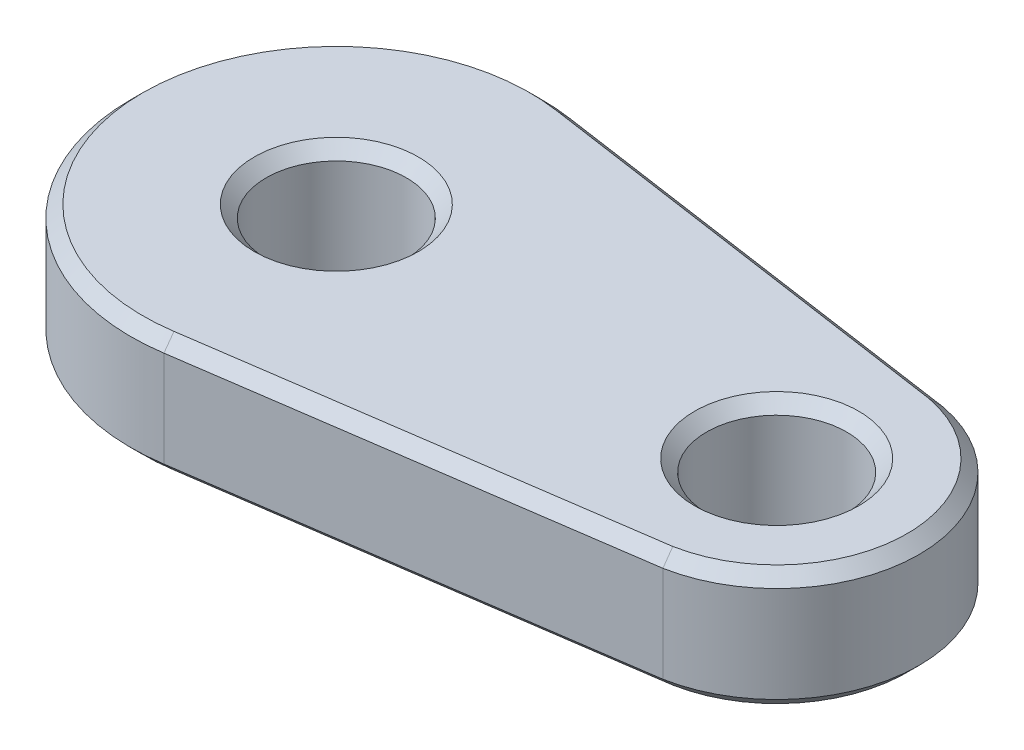
ISO-10303-21;
HEADER;
FILE_DESCRIPTION(('STEP AP214'),'2;1');
FILE_NAME('part.step','',(''),(''),'','','');
FILE_SCHEMA(('AUTOMOTIVE_DESIGN { 1 0 10303 214 1 1 1 1 }'));
ENDSEC;
DATA;
#1=APPLICATION_CONTEXT('core data for automotive mechanical design processes');
#2=APPLICATION_PROTOCOL_DEFINITION('international standard','automotive_design',2000,#1);
#3=PRODUCT_CONTEXT('',#1,'mechanical');
#4=PRODUCT('Part','Part','',(#3));
#5=PRODUCT_RELATED_PRODUCT_CATEGORY('part','',(#4));
#6=PRODUCT_DEFINITION_FORMATION('','',#4);
#7=PRODUCT_DEFINITION_CONTEXT('part definition',#1,'design');
#8=PRODUCT_DEFINITION('design','',#6,#7);
#9=PRODUCT_DEFINITION_SHAPE('','',#8);
#10=(LENGTH_UNIT() NAMED_UNIT(*) SI_UNIT(.MILLI.,.METRE.));
#11=(NAMED_UNIT(*) PLANE_ANGLE_UNIT() SI_UNIT($,.RADIAN.));
#12=(NAMED_UNIT(*) SI_UNIT($,.STERADIAN.) SOLID_ANGLE_UNIT());
#13=UNCERTAINTY_MEASURE_WITH_UNIT(LENGTH_MEASURE(1.E-05),#10,'distance_accuracy_value','');
#14=(GEOMETRIC_REPRESENTATION_CONTEXT(3) GLOBAL_UNCERTAINTY_ASSIGNED_CONTEXT((#13)) GLOBAL_UNIT_ASSIGNED_CONTEXT((#10,
#11,#12)) REPRESENTATION_CONTEXT('',''));
#15=CARTESIAN_POINT('',(0.,0.,0.));
#16=DIRECTION('',(0.,0.,1.));
#17=DIRECTION('',(1.,0.,0.));
#18=AXIS2_PLACEMENT_3D('',#15,#16,#17);
#19=CARTESIAN_POINT('',(-7.70223370199061,3.,0.0991235218647689));
#20=DIRECTION('',(0.,1.,0.));
#21=DIRECTION('',(0.,0.,1.));
#22=AXIS2_PLACEMENT_3D('',#19,#20,#21);
#23=PLANE('',#22);
#24=CARTESIAN_POINT('',(-7.70223370199061,3.,0.0991235218647689));
#25=DIRECTION('',(0.,1.,0.));
#26=DIRECTION('',(0.,0.,1.));
#27=AXIS2_PLACEMENT_3D('',#24,#25,#26);
#28=CIRCLE('',#27,2.05);
#29=CARTESIAN_POINT('',(-7.70223370199061,3.,2.14912352186477));
#30=VERTEX_POINT('',#29);
#31=EDGE_CURVE('E215',#30,#30,#28,.F.);
#32=ORIENTED_EDGE('',*,*,#31,.T.);
#33=EDGE_LOOP('',(#32));
#34=FACE_BOUND('',#33,.T.);
#35=CARTESIAN_POINT('',(3.29776629800939,3.,0.0991235218647689));
#36=DIRECTION('',(0.,1.,0.));
#37=DIRECTION('',(0.,0.,1.));
#38=AXIS2_PLACEMENT_3D('',#35,#36,#37);
#39=CIRCLE('',#38,2.05);
#40=CARTESIAN_POINT('',(3.29776629800939,3.,2.14912352186477));
#41=VERTEX_POINT('',#40);
#42=EDGE_CURVE('E218',#41,#41,#39,.F.);
#43=ORIENTED_EDGE('',*,*,#42,.T.);
#44=EDGE_LOOP('',(#43));
#45=FACE_BOUND('',#44,.T.);
#46=CARTESIAN_POINT('',(-7.70223370199061,3.,0.0991235218647689));
#47=DIRECTION('',(0.,1.,0.));
#48=DIRECTION('',(0.,0.,1.));
#49=AXIS2_PLACEMENT_3D('',#46,#47,#48);
#50=CIRCLE('',#49,4.83083221951205);
#51=CARTESIAN_POINT('',(-6.97813535852521,3.,-4.67713862101216));
#52=VERTEX_POINT('',#51);
#53=CARTESIAN_POINT('',(-6.97996542673466,3.,4.87565662356463));
#54=VERTEX_POINT('',#53);
#55=EDGE_CURVE('E124',#52,#54,#50,.T.);
#56=ORIENTED_EDGE('',*,*,#55,.T.);
#57=DIRECTION('',(0.989663079395742,0.,-0.143411956548045));
#58=VECTOR('',#57,1.);
#59=CARTESIAN_POINT('',(3.90891488112202,3.,3.29774453776546));
#60=LINE('',#59,#58);
#61=CARTESIAN_POINT('',(3.90267861560925,3.,3.29864823424294));
#62=VERTEX_POINT('',#61);
#63=EDGE_CURVE('E120',#54,#62,#60,.T.);
#64=ORIENTED_EDGE('',*,*,#63,.T.);
#65=CARTESIAN_POINT('',(3.29776629800939,3.,0.0991235218647689));
#66=DIRECTION('',(0.,1.,0.));
#67=DIRECTION('',(0.,0.,1.));
#68=AXIS2_PLACEMENT_3D('',#65,#66,#67);
#69=CIRCLE('',#68,3.25620596662782);
#70=CARTESIAN_POINT('',(3.90267861560922,3.,-3.10040119051341));
#71=VERTEX_POINT('',#70);
#72=EDGE_CURVE('E115',#62,#71,#69,.T.);
#73=ORIENTED_EDGE('',*,*,#72,.T.);
#74=DIRECTION('',(-0.989663079395742,0.,-0.143411956548045));
#75=VECTOR('',#74,1.);
#76=CARTESIAN_POINT('',(-6.97813535852521,3.,-4.67713862101216));
#77=LINE('',#76,#75);
#78=EDGE_CURVE('E117',#71,#52,#77,.T.);
#79=ORIENTED_EDGE('',*,*,#78,.T.);
#80=EDGE_LOOP('',(#56,#64,#73,#79));
#81=FACE_BOUND('',#80,.T.);
#82=ADVANCED_FACE('F41',(#34,#45,#81),#23,.T.);
#83=CARTESIAN_POINT('',(-7.70223370199061,0.,0.0991235218647689));
#84=DIRECTION('',(0.,1.,0.));
#85=DIRECTION('',(0.,0.,1.));
#86=AXIS2_PLACEMENT_3D('',#83,#84,#85);
#87=PLANE('',#86);
#88=CARTESIAN_POINT('',(-7.70223370199061,0.,0.0991235218647689));
#89=DIRECTION('',(0.,1.,0.));
#90=DIRECTION('',(0.,0.,1.));
#91=AXIS2_PLACEMENT_3D('',#88,#89,#90);
#92=CIRCLE('',#91,2.05);
#93=CARTESIAN_POINT('',(-7.70223370199061,0.,2.14912352186477));
#94=VERTEX_POINT('',#93);
#95=EDGE_CURVE('E195',#94,#94,#92,.T.);
#96=ORIENTED_EDGE('',*,*,#95,.T.);
#97=EDGE_LOOP('',(#96));
#98=FACE_BOUND('',#97,.T.);
#99=CARTESIAN_POINT('',(3.29776629800939,0.,0.0991235218647689));
#100=DIRECTION('',(0.,1.,0.));
#101=DIRECTION('',(0.,0.,1.));
#102=AXIS2_PLACEMENT_3D('',#99,#100,#101);
#103=CIRCLE('',#102,2.05);
#104=CARTESIAN_POINT('',(3.29776629800939,0.,2.14912352186477));
#105=VERTEX_POINT('',#104);
#106=EDGE_CURVE('E198',#105,#105,#103,.T.);
#107=ORIENTED_EDGE('',*,*,#106,.T.);
#108=EDGE_LOOP('',(#107));
#109=FACE_BOUND('',#108,.T.);
#110=DIRECTION('',(-0.989663079395742,0.,0.143411956548045));
#111=VECTOR('',#110,1.);
#112=CARTESIAN_POINT('',(-7.00944859276522,0.,4.87992326170949));
#113=LINE('',#112,#111);
#114=CARTESIAN_POINT('',(3.90267861560924,0.,3.29864823424293));
#115=VERTEX_POINT('',#114);
#116=CARTESIAN_POINT('',(-6.9799662447967,0.,4.87565097824876));
#117=VERTEX_POINT('',#116);
#118=EDGE_CURVE('E204',#115,#117,#113,.T.);
#119=ORIENTED_EDGE('',*,*,#118,.T.);
#120=CARTESIAN_POINT('',(-7.70223370199061,0.,0.0991235218647689));
#121=DIRECTION('',(0.,1.,0.));
#122=DIRECTION('',(0.,0.,1.));
#123=AXIS2_PLACEMENT_3D('',#120,#121,#122);
#124=CIRCLE('',#123,4.83083221951204);
#125=CARTESIAN_POINT('',(-6.9799662447967,0.,-4.67740393451922));
#126=VERTEX_POINT('',#125);
#127=EDGE_CURVE('E201',#117,#126,#124,.F.);
#128=ORIENTED_EDGE('',*,*,#127,.T.);
#129=DIRECTION('',(0.989663079395742,0.,0.143411956548045));
#130=VECTOR('',#129,1.);
#131=CARTESIAN_POINT('',(-7.00944859276522,0.,-4.68167621797995));
#132=LINE('',#131,#130);
#133=CARTESIAN_POINT('',(3.90267861560925,0.,-3.10040119051339));
#134=VERTEX_POINT('',#133);
#135=EDGE_CURVE('E208',#126,#134,#132,.T.);
#136=ORIENTED_EDGE('',*,*,#135,.T.);
#137=CARTESIAN_POINT('',(3.29776629800939,0.,0.0991235218647689));
#138=DIRECTION('',(0.,1.,0.));
#139=DIRECTION('',(0.,0.,1.));
#140=AXIS2_PLACEMENT_3D('',#137,#138,#139);
#141=CIRCLE('',#140,3.25620596662782);
#142=EDGE_CURVE('E206',#134,#115,#141,.F.);
#143=ORIENTED_EDGE('',*,*,#142,.T.);
#144=EDGE_LOOP('',(#119,#128,#136,#143));
#145=FACE_BOUND('',#144,.T.);
#146=ADVANCED_FACE('F279',(#98,#109,#145),#87,.F.);
#147=CARTESIAN_POINT('',(-7.70223370199061,3.,0.0991235218647689));
#148=DIRECTION('',(0.,-1.,0.));
#149=DIRECTION('',(0.,0.,-1.));
#150=AXIS2_PLACEMENT_3D('',#147,#148,#149);
#151=CYLINDRICAL_SURFACE('',#150,5.13083221951205);
#152=DIRECTION('',(0.,-1.,0.));
#153=VECTOR('',#152,1.);
#154=CARTESIAN_POINT('',(-6.9351117715608,3.,-4.97403754483088));
#155=LINE('',#154,#153);
#156=CARTESIAN_POINT('',(-6.9351117715608,2.7,-4.97403754483088));
#157=VERTEX_POINT('',#156);
#158=CARTESIAN_POINT('',(-6.9351117715608,0.300000000000005,-4.97403754483088));
#159=VERTEX_POINT('',#158);
#160=EDGE_CURVE('E140',#157,#159,#155,.T.);
#161=ORIENTED_EDGE('',*,*,#160,.T.);
#162=CARTESIAN_POINT('',(-7.70223370199061,0.300000000000005,0.0991235218647689));
#163=DIRECTION('',(0.,1.,0.));
#164=DIRECTION('',(0.,0.,1.));
#165=AXIS2_PLACEMENT_3D('',#162,#163,#164);
#166=CIRCLE('',#165,5.13083221951205);
#167=CARTESIAN_POINT('',(-6.9351117715608,0.300000000000005,5.17228458856042));
#168=VERTEX_POINT('',#167);
#169=EDGE_CURVE('E178',#159,#168,#166,.T.);
#170=ORIENTED_EDGE('',*,*,#169,.T.);
#171=DIRECTION('',(0.,-1.,0.));
#172=VECTOR('',#171,1.);
#173=CARTESIAN_POINT('',(-6.9351117715608,3.,5.17228458856042));
#174=LINE('',#173,#172);
#175=CARTESIAN_POINT('',(-6.9351117715608,2.7,5.17228458856042));
#176=VERTEX_POINT('',#175);
#177=EDGE_CURVE('E134',#176,#168,#174,.T.);
#178=ORIENTED_EDGE('',*,*,#177,.F.);
#179=CARTESIAN_POINT('',(-7.70223370199061,2.7,0.0991235218647689));
#180=DIRECTION('',(0.,1.,0.));
#181=DIRECTION('',(0.,0.,1.));
#182=AXIS2_PLACEMENT_3D('',#179,#180,#181);
#183=CIRCLE('',#182,5.13083221951205);
#184=EDGE_CURVE('E181',#176,#157,#183,.F.);
#185=ORIENTED_EDGE('',*,*,#184,.T.);
#186=EDGE_LOOP('',(#161,#170,#178,#185));
#187=FACE_BOUND('',#186,.T.);
#188=ADVANCED_FACE('F166',(#187),#151,.T.);
#189=CARTESIAN_POINT('',(-6.9351117715608,3.,5.17228458856042));
#190=DIRECTION('',(-0.143411956548045,0.,-0.989663079395741));
#191=DIRECTION('',(-0.989663079395742,0.,0.143411956548045));
#192=AXIS2_PLACEMENT_3D('',#189,#190,#191);
#193=PLANE('',#192);
#194=DIRECTION('',(0.,-1.,0.));
#195=VECTOR('',#194,1.);
#196=CARTESIAN_POINT('',(3.95193846808644,3.,3.59464346158418));
#197=LINE('',#196,#195);
#198=CARTESIAN_POINT('',(3.95193846808644,2.7,3.59464346158418));
#199=VERTEX_POINT('',#198);
#200=CARTESIAN_POINT('',(3.95193846808644,0.300000000000005,3.59464346158418));
#201=VERTEX_POINT('',#200);
#202=EDGE_CURVE('E225',#199,#201,#197,.T.);
#203=ORIENTED_EDGE('',*,*,#202,.F.);
#204=DIRECTION('',(-0.989663079395742,0.,0.143411956548045));
#205=VECTOR('',#204,1.);
#206=CARTESIAN_POINT('',(-6.9351117715608,2.7,5.17228458856042));
#207=LINE('',#206,#205);
#208=EDGE_CURVE('E210',#199,#176,#207,.T.);
#209=ORIENTED_EDGE('',*,*,#208,.T.);
#210=ORIENTED_EDGE('',*,*,#177,.T.);
#211=DIRECTION('',(0.989663079395742,0.,-0.143411956548045));
#212=VECTOR('',#211,1.);
#213=CARTESIAN_POINT('',(-6.9351117715608,0.300000000000005,5.17228458856042));
#214=LINE('',#213,#212);
#215=EDGE_CURVE('E213',#168,#201,#214,.T.);
#216=ORIENTED_EDGE('',*,*,#215,.T.);
#217=EDGE_LOOP('',(#203,#209,#210,#216));
#218=FACE_BOUND('',#217,.T.);
#219=ADVANCED_FACE('F255',(#218),#193,.F.);
#220=CARTESIAN_POINT('',(3.29776629800939,3.,0.0991235218647689));
#221=DIRECTION('',(0.,-1.,0.));
#222=DIRECTION('',(0.,0.,-1.));
#223=AXIS2_PLACEMENT_3D('',#220,#221,#222);
#224=CYLINDRICAL_SURFACE('',#223,3.55620596662782);
#225=ORIENTED_EDGE('',*,*,#202,.T.);
#226=CARTESIAN_POINT('',(3.29776629800939,0.300000000000005,0.0991235218647689));
#227=DIRECTION('',(0.,1.,0.));
#228=DIRECTION('',(0.,0.,1.));
#229=AXIS2_PLACEMENT_3D('',#226,#227,#228);
#230=CIRCLE('',#229,3.55620596662782);
#231=CARTESIAN_POINT('',(3.95193846808644,0.300000000000005,-3.39639641785464));
#232=VERTEX_POINT('',#231);
#233=EDGE_CURVE('E65',#201,#232,#230,.T.);
#234=ORIENTED_EDGE('',*,*,#233,.T.);
#235=DIRECTION('',(0.,-1.,0.));
#236=VECTOR('',#235,1.);
#237=CARTESIAN_POINT('',(3.95193846808644,3.,-3.39639641785464));
#238=LINE('',#237,#236);
#239=CARTESIAN_POINT('',(3.95193846808644,2.7,-3.39639641785464));
#240=VERTEX_POINT('',#239);
#241=EDGE_CURVE('E227',#240,#232,#238,.T.);
#242=ORIENTED_EDGE('',*,*,#241,.F.);
#243=CARTESIAN_POINT('',(3.29776629800939,2.7,0.0991235218647689));
#244=DIRECTION('',(0.,1.,0.));
#245=DIRECTION('',(0.,0.,1.));
#246=AXIS2_PLACEMENT_3D('',#243,#244,#245);
#247=CIRCLE('',#246,3.55620596662782);
#248=EDGE_CURVE('E137',#240,#199,#247,.F.);
#249=ORIENTED_EDGE('',*,*,#248,.T.);
#250=EDGE_LOOP('',(#225,#234,#242,#249));
#251=FACE_BOUND('',#250,.T.);
#252=ADVANCED_FACE('F257',(#251),#224,.T.);
#253=CARTESIAN_POINT('',(-6.9351117715608,3.,-4.97403754483088));
#254=DIRECTION('',(-0.143411956548045,0.,0.989663079395741));
#255=DIRECTION('',(0.989663079395742,0.,0.143411956548045));
#256=AXIS2_PLACEMENT_3D('',#253,#254,#255);
#257=PLANE('',#256);
#258=ORIENTED_EDGE('',*,*,#241,.T.);
#259=DIRECTION('',(-0.989663079395742,0.,-0.143411956548045));
#260=VECTOR('',#259,1.);
#261=CARTESIAN_POINT('',(-6.9351117715608,0.300000000000005,-4.97403754483088));
#262=LINE('',#261,#260);
#263=EDGE_CURVE('E11',#232,#159,#262,.T.);
#264=ORIENTED_EDGE('',*,*,#263,.T.);
#265=ORIENTED_EDGE('',*,*,#160,.F.);
#266=DIRECTION('',(0.989663079395742,0.,0.143411956548045));
#267=VECTOR('',#266,1.);
#268=CARTESIAN_POINT('',(3.95193846808644,2.7,-3.39639641785464));
#269=LINE('',#268,#267);
#270=EDGE_CURVE('E57',#157,#240,#269,.T.);
#271=ORIENTED_EDGE('',*,*,#270,.T.);
#272=EDGE_LOOP('',(#258,#264,#265,#271));
#273=FACE_BOUND('',#272,.T.);
#274=ADVANCED_FACE('F292',(#273),#257,.F.);
#275=CARTESIAN_POINT('',(-7.70223370199061,3.,0.0991235218647689));
#276=DIRECTION('',(0.,-1.,0.));
#277=DIRECTION('',(0.,0.,-1.));
#278=AXIS2_PLACEMENT_3D('',#275,#276,#277);
#279=CYLINDRICAL_SURFACE('',#278,1.75);
#280=CARTESIAN_POINT('',(-7.70223370199061,0.300000000000003,0.0991235218647689));
#281=DIRECTION('',(0.,1.,0.));
#282=DIRECTION('',(0.,0.,1.));
#283=AXIS2_PLACEMENT_3D('',#280,#281,#282);
#284=CIRCLE('',#283,1.75);
#285=CARTESIAN_POINT('',(-7.70223370199061,0.300000000000003,1.84912352186477));
#286=VERTEX_POINT('',#285);
#287=EDGE_CURVE('E189',#286,#286,#284,.F.);
#288=ORIENTED_EDGE('',*,*,#287,.T.);
#289=EDGE_LOOP('',(#288));
#290=FACE_BOUND('',#289,.T.);
#291=CARTESIAN_POINT('',(-7.70223370199061,2.70000000000001,0.0991235218647689));
#292=DIRECTION('',(0.,1.,0.));
#293=DIRECTION('',(0.,0.,1.));
#294=AXIS2_PLACEMENT_3D('',#291,#292,#293);
#295=CIRCLE('',#294,1.75);
#296=CARTESIAN_POINT('',(-7.70223370199061,2.70000000000001,1.84912352186477));
#297=VERTEX_POINT('',#296);
#298=EDGE_CURVE('E192',#297,#297,#295,.T.);
#299=ORIENTED_EDGE('',*,*,#298,.T.);
#300=EDGE_LOOP('',(#299));
#301=FACE_BOUND('',#300,.T.);
#302=ADVANCED_FACE('F289',(#290,#301),#279,.F.);
#303=CARTESIAN_POINT('',(3.29776629800939,3.,0.0991235218647689));
#304=DIRECTION('',(0.,-1.,0.));
#305=DIRECTION('',(0.,0.,-1.));
#306=AXIS2_PLACEMENT_3D('',#303,#304,#305);
#307=CYLINDRICAL_SURFACE('',#306,1.75);
#308=CARTESIAN_POINT('',(3.29776629800939,0.300000000000003,0.0991235218647689));
#309=DIRECTION('',(0.,1.,0.));
#310=DIRECTION('',(0.,0.,1.));
#311=AXIS2_PLACEMENT_3D('',#308,#309,#310);
#312=CIRCLE('',#311,1.75);
#313=CARTESIAN_POINT('',(3.29776629800939,0.300000000000003,1.84912352186477));
#314=VERTEX_POINT('',#313);
#315=EDGE_CURVE('E183',#314,#314,#312,.F.);
#316=ORIENTED_EDGE('',*,*,#315,.T.);
#317=EDGE_LOOP('',(#316));
#318=FACE_BOUND('',#317,.T.);
#319=CARTESIAN_POINT('',(3.29776629800939,2.70000000000001,0.0991235218647689));
#320=DIRECTION('',(0.,1.,0.));
#321=DIRECTION('',(0.,0.,1.));
#322=AXIS2_PLACEMENT_3D('',#319,#320,#321);
#323=CIRCLE('',#322,1.75);
#324=CARTESIAN_POINT('',(3.29776629800939,2.70000000000001,1.84912352186477));
#325=VERTEX_POINT('',#324);
#326=EDGE_CURVE('E186',#325,#325,#323,.T.);
#327=ORIENTED_EDGE('',*,*,#326,.T.);
#328=EDGE_LOOP('',(#327));
#329=FACE_BOUND('',#328,.T.);
#330=ADVANCED_FACE('F344',(#318,#329),#307,.F.);
#331=CARTESIAN_POINT('',(-7.00944859276522,3.,-4.68167621797996));
#332=DIRECTION('',(0.101407566978353,0.707106781186546,-0.699797474530691));
#333=DIRECTION('',(0.989663079395742,0.,0.143411956548045));
#334=AXIS2_PLACEMENT_3D('',#331,#332,#333);
#335=PLANE('',#334);
#336=CARTESIAN_POINT('',(3.90267861560922,3.,-3.10040119051341));
#337=CARTESIAN_POINT('',(3.91091145801008,2.95000024297606,-3.14973016923725));
#338=CARTESIAN_POINT('',(3.91913286692178,2.90000036443461,-3.19906092757336));
#339=CARTESIAN_POINT('',(3.93555281774746,2.80000036443461,-3.29772600335378));
#340=CARTESIAN_POINT('',(3.94375135966151,2.75000024297606,-3.34706032079808));
#341=CARTESIAN_POINT('',(3.95193846808645,2.7,-3.39639641785464));
#342=B_SPLINE_CURVE_WITH_KNOTS('',3,(#336,#337,#338,#339,#340,#341),.UNSPECIFIED.,.F.,.F.,(4,2,
4),(0.,0.212155434127949,0.424310867755587),.UNSPECIFIED.);
#343=EDGE_CURVE('E129',#240,#71,#342,.F.);
#344=ORIENTED_EDGE('',*,*,#343,.F.);
#345=ORIENTED_EDGE('',*,*,#270,.F.);
#346=DIRECTION('',(0.101407566978354,-0.70710678118655,-0.699797474530687));
#347=VECTOR('',#346,1.);
#348=CARTESIAN_POINT('',(-6.97813535852521,3.,-4.67713862101216));
#349=LINE('',#348,#347);
#350=EDGE_CURVE('E132',#52,#157,#349,.T.);
#351=ORIENTED_EDGE('',*,*,#350,.F.);
#352=ORIENTED_EDGE('',*,*,#78,.F.);
#353=EDGE_LOOP('',(#344,#345,#351,#352));
#354=FACE_BOUND('',#353,.T.);
#355=ADVANCED_FACE('F128',(#354),#335,.T.);
#356=CARTESIAN_POINT('',(-7.70223370199061,3.,0.0991235218647689));
#357=DIRECTION('',(0.,-1.,0.));
#358=DIRECTION('',(0.,0.,-1.));
#359=AXIS2_PLACEMENT_3D('',#356,#357,#358);
#360=CONICAL_SURFACE('',#359,4.83083221951205,0.785398163397447);
#361=ORIENTED_EDGE('',*,*,#350,.T.);
#362=ORIENTED_EDGE('',*,*,#184,.F.);
#363=DIRECTION('',(0.105721079114807,-0.707106781186549,0.699158818460297));
#364=VECTOR('',#363,1.);
#365=CARTESIAN_POINT('',(-6.97996542673466,3.,4.87565662356463));
#366=LINE('',#365,#364);
#367=EDGE_CURVE('E138',#54,#176,#366,.T.);
#368=ORIENTED_EDGE('',*,*,#367,.F.);
#369=ORIENTED_EDGE('',*,*,#55,.F.);
#370=EDGE_LOOP('',(#361,#362,#368,#369));
#371=FACE_BOUND('',#370,.T.);
#372=ADVANCED_FACE('F165',(#371),#360,.T.);
#373=CARTESIAN_POINT('',(3.29776629800939,3.,0.0991235218647689));
#374=DIRECTION('',(0.,-1.,0.));
#375=DIRECTION('',(0.,0.,-1.));
#376=AXIS2_PLACEMENT_3D('',#373,#374,#375);
#377=CONICAL_SURFACE('',#376,3.25620596662782,0.785398163397446);
#378=ORIENTED_EDGE('',*,*,#343,.T.);
#379=ORIENTED_EDGE('',*,*,#72,.F.);
#380=CARTESIAN_POINT('',(3.90267861560925,3.,3.29864823424294));
#381=CARTESIAN_POINT('',(3.91091145801011,2.95000024297606,3.34797721296678));
#382=CARTESIAN_POINT('',(3.9191328669218,2.90000036443461,3.39730797130289));
#383=CARTESIAN_POINT('',(3.93555281774748,2.80000036443461,3.49597304708331));
#384=CARTESIAN_POINT('',(3.94375135966152,2.75000024297606,3.54530736452762));
#385=CARTESIAN_POINT('',(3.95193846808645,2.7,3.59464346158418));
#386=B_SPLINE_CURVE_WITH_KNOTS('',3,(#380,#381,#382,#383,#384,#385),.UNSPECIFIED.,.F.,.F.,(4,2,
4),(0.,0.212155434127949,0.424310867755587),.UNSPECIFIED.);
#387=EDGE_CURVE('E142',#199,#62,#386,.F.);
#388=ORIENTED_EDGE('',*,*,#387,.F.);
#389=ORIENTED_EDGE('',*,*,#248,.F.);
#390=EDGE_LOOP('',(#378,#379,#388,#389));
#391=FACE_BOUND('',#390,.T.);
#392=ADVANCED_FACE('F136',(#391),#377,.T.);
#393=CARTESIAN_POINT('',(-7.00944859276522,3.,4.8799232617095));
#394=DIRECTION('',(0.101407566978353,0.707106781186547,0.69979747453069));
#395=DIRECTION('',(-0.989663079395742,0.,0.143411956548045));
#396=AXIS2_PLACEMENT_3D('',#393,#394,#395);
#397=PLANE('',#396);
#398=ORIENTED_EDGE('',*,*,#367,.T.);
#399=ORIENTED_EDGE('',*,*,#208,.F.);
#400=ORIENTED_EDGE('',*,*,#387,.T.);
#401=ORIENTED_EDGE('',*,*,#63,.F.);
#402=EDGE_LOOP('',(#398,#399,#400,#401));
#403=FACE_BOUND('',#402,.T.);
#404=ADVANCED_FACE('F164',(#403),#397,.T.);
#405=CARTESIAN_POINT('',(-7.70223370199061,0.,0.0991235218647689));
#406=DIRECTION('',(0.,-1.,0.));
#407=DIRECTION('',(0.,0.,-1.));
#408=AXIS2_PLACEMENT_3D('',#405,#406,#407);
#409=CONICAL_SURFACE('',#408,2.05,0.785398163397445);
#410=ORIENTED_EDGE('',*,*,#287,.F.);
#411=EDGE_LOOP('',(#410));
#412=FACE_BOUND('',#411,.T.);
#413=ORIENTED_EDGE('',*,*,#95,.F.);
#414=EDGE_LOOP('',(#413));
#415=FACE_BOUND('',#414,.T.);
#416=ADVANCED_FACE('F382',(#412,#415),#409,.F.);
#417=CARTESIAN_POINT('',(-7.70223370199061,2.70000000000001,0.0991235218647689));
#418=DIRECTION('',(0.,1.,0.));
#419=DIRECTION('',(0.,0.,1.));
#420=AXIS2_PLACEMENT_3D('',#417,#418,#419);
#421=CONICAL_SURFACE('',#420,1.75,0.785398163397454);
#422=ORIENTED_EDGE('',*,*,#31,.F.);
#423=EDGE_LOOP('',(#422));
#424=FACE_BOUND('',#423,.T.);
#425=ORIENTED_EDGE('',*,*,#298,.F.);
#426=EDGE_LOOP('',(#425));
#427=FACE_BOUND('',#426,.T.);
#428=ADVANCED_FACE('F391',(#424,#427),#421,.F.);
#429=CARTESIAN_POINT('',(3.29776629800939,0.,0.0991235218647689));
#430=DIRECTION('',(0.,-1.,0.));
#431=DIRECTION('',(0.,0.,-1.));
#432=AXIS2_PLACEMENT_3D('',#429,#430,#431);
#433=CONICAL_SURFACE('',#432,2.05,0.785398163397445);
#434=ORIENTED_EDGE('',*,*,#315,.F.);
#435=EDGE_LOOP('',(#434));
#436=FACE_BOUND('',#435,.T.);
#437=ORIENTED_EDGE('',*,*,#106,.F.);
#438=EDGE_LOOP('',(#437));
#439=FACE_BOUND('',#438,.T.);
#440=ADVANCED_FACE('F401',(#436,#439),#433,.F.);
#441=CARTESIAN_POINT('',(3.29776629800939,2.70000000000001,0.0991235218647689));
#442=DIRECTION('',(0.,1.,0.));
#443=DIRECTION('',(0.,0.,1.));
#444=AXIS2_PLACEMENT_3D('',#441,#442,#443);
#445=CONICAL_SURFACE('',#444,1.75,0.785398163397454);
#446=ORIENTED_EDGE('',*,*,#42,.F.);
#447=EDGE_LOOP('',(#446));
#448=FACE_BOUND('',#447,.T.);
#449=ORIENTED_EDGE('',*,*,#326,.F.);
#450=EDGE_LOOP('',(#449));
#451=FACE_BOUND('',#450,.T.);
#452=ADVANCED_FACE('F411',(#448,#451),#445,.F.);
#453=CARTESIAN_POINT('',(3.29776629800939,0.300000000000005,0.0991235218647689));
#454=DIRECTION('',(0.,1.,0.));
#455=DIRECTION('',(0.,0.,1.));
#456=AXIS2_PLACEMENT_3D('',#453,#454,#455);
#457=CONICAL_SURFACE('',#456,3.55620596662782,0.785398163397446);
#458=CARTESIAN_POINT('',(3.95193846808644,0.300000000000005,3.59464346158418));
#459=CARTESIAN_POINT('',(3.94375135966151,0.249999757023949,3.54530736452762));
#460=CARTESIAN_POINT('',(3.93555281774747,0.199999635565399,3.49597304708331));
#461=CARTESIAN_POINT('',(3.91913286692179,0.0999996355653962,3.39730797130289));
#462=CARTESIAN_POINT('',(3.9109114580101,0.0499997570239451,3.34797721296678));
#463=CARTESIAN_POINT('',(3.90267861560925,0.,3.29864823424293));
#464=B_SPLINE_CURVE_WITH_KNOTS('',3,(#458,#459,#460,#461,#462,#463),.UNSPECIFIED.,.F.,.F.,(4,2,
4),(0.,0.212155433627642,0.424310867755597),.UNSPECIFIED.);
#465=EDGE_CURVE('E242',#115,#201,#464,.F.);
#466=ORIENTED_EDGE('',*,*,#465,.F.);
#467=ORIENTED_EDGE('',*,*,#142,.F.);
#468=CARTESIAN_POINT('',(3.95193846808644,0.300000000000005,-3.39639641785464));
#469=CARTESIAN_POINT('',(3.94375135966151,0.249999757023949,-3.34706032079808));
#470=CARTESIAN_POINT('',(3.93555281774746,0.199999635565398,-3.29772600335378));
#471=CARTESIAN_POINT('',(3.91913286692179,0.0999996355653959,-3.19906092757335));
#472=CARTESIAN_POINT('',(3.91091145801011,0.0499997570239448,-3.14973016923724));
#473=CARTESIAN_POINT('',(3.90267861560926,0.,-3.10040119051339));
#474=B_SPLINE_CURVE_WITH_KNOTS('',3,(#468,#469,#470,#471,#472,#473),.UNSPECIFIED.,.F.,.F.,(4,2,
4),(0.,0.212155433627643,0.424310867755597),.UNSPECIFIED.);
#475=EDGE_CURVE('E47',#232,#134,#474,.T.);
#476=ORIENTED_EDGE('',*,*,#475,.F.);
#477=ORIENTED_EDGE('',*,*,#233,.F.);
#478=EDGE_LOOP('',(#466,#467,#476,#477));
#479=FACE_BOUND('',#478,.T.);
#480=ADVANCED_FACE('F260',(#479),#457,.T.);
#481=CARTESIAN_POINT('',(-6.9351117715608,0.300000000000005,-4.97403754483088));
#482=DIRECTION('',(-0.101407566978353,0.707106781186547,0.69979747453069));
#483=DIRECTION('',(-0.989663079395742,0.,-0.143411956548045));
#484=AXIS2_PLACEMENT_3D('',#481,#482,#483);
#485=PLANE('',#484);
#486=ORIENTED_EDGE('',*,*,#475,.T.);
#487=ORIENTED_EDGE('',*,*,#135,.F.);
#488=DIRECTION('',(-0.105722002206579,-0.707100058787217,0.699165477632117));
#489=VECTOR('',#488,1.);
#490=CARTESIAN_POINT('',(-6.9351117715608,0.300000000000005,-4.97403754483088));
#491=LINE('',#490,#489);
#492=EDGE_CURVE('E238',#159,#126,#491,.T.);
#493=ORIENTED_EDGE('',*,*,#492,.F.);
#494=ORIENTED_EDGE('',*,*,#263,.F.);
#495=EDGE_LOOP('',(#486,#487,#493,#494));
#496=FACE_BOUND('',#495,.T.);
#497=ADVANCED_FACE('F44',(#496),#485,.F.);
#498=CARTESIAN_POINT('',(-6.9351117715608,0.300000000000005,5.17228458856042));
#499=DIRECTION('',(-0.101407566978353,0.707106781186547,-0.69979747453069));
#500=DIRECTION('',(0.989663079395742,0.,-0.143411956548045));
#501=AXIS2_PLACEMENT_3D('',#498,#499,#500);
#502=PLANE('',#501);
#503=ORIENTED_EDGE('',*,*,#465,.T.);
#504=ORIENTED_EDGE('',*,*,#215,.F.);
#505=DIRECTION('',(0.105722002206579,0.707100058787218,0.699165477632115));
#506=VECTOR('',#505,1.);
#507=CARTESIAN_POINT('',(-6.9799662447967,0.,4.87565097824876));
#508=LINE('',#507,#506);
#509=EDGE_CURVE('E243',#117,#168,#508,.T.);
#510=ORIENTED_EDGE('',*,*,#509,.F.);
#511=ORIENTED_EDGE('',*,*,#118,.F.);
#512=EDGE_LOOP('',(#503,#504,#510,#511));
#513=FACE_BOUND('',#512,.T.);
#514=ADVANCED_FACE('F251',(#513),#502,.F.);
#515=CARTESIAN_POINT('',(-7.70223370199061,0.300000000000005,0.0991235218647689));
#516=DIRECTION('',(0.,1.,0.));
#517=DIRECTION('',(0.,0.,1.));
#518=AXIS2_PLACEMENT_3D('',#515,#516,#517);
#519=CONICAL_SURFACE('',#518,5.13083221951205,0.785398163397447);
#520=ORIENTED_EDGE('',*,*,#492,.T.);
#521=ORIENTED_EDGE('',*,*,#127,.F.);
#522=ORIENTED_EDGE('',*,*,#509,.T.);
#523=ORIENTED_EDGE('',*,*,#169,.F.);
#524=EDGE_LOOP('',(#520,#521,#522,#523));
#525=FACE_BOUND('',#524,.T.);
#526=ADVANCED_FACE('F245',(#525),#519,.T.);
#527=CLOSED_SHELL('',(#82,#146,#188,#219,#252,#274,#302,#330,#355,#372,#392,#404,#416,#428,#440,
#452,#480,#497,#514,#526));
#528=MANIFOLD_SOLID_BREP('B2',#527);
#529=ADVANCED_BREP_SHAPE_REPRESENTATION('',(#18,#528),#14);
#530=SHAPE_DEFINITION_REPRESENTATION(#9,#529);
ENDSEC;
END-ISO-10303-21;
